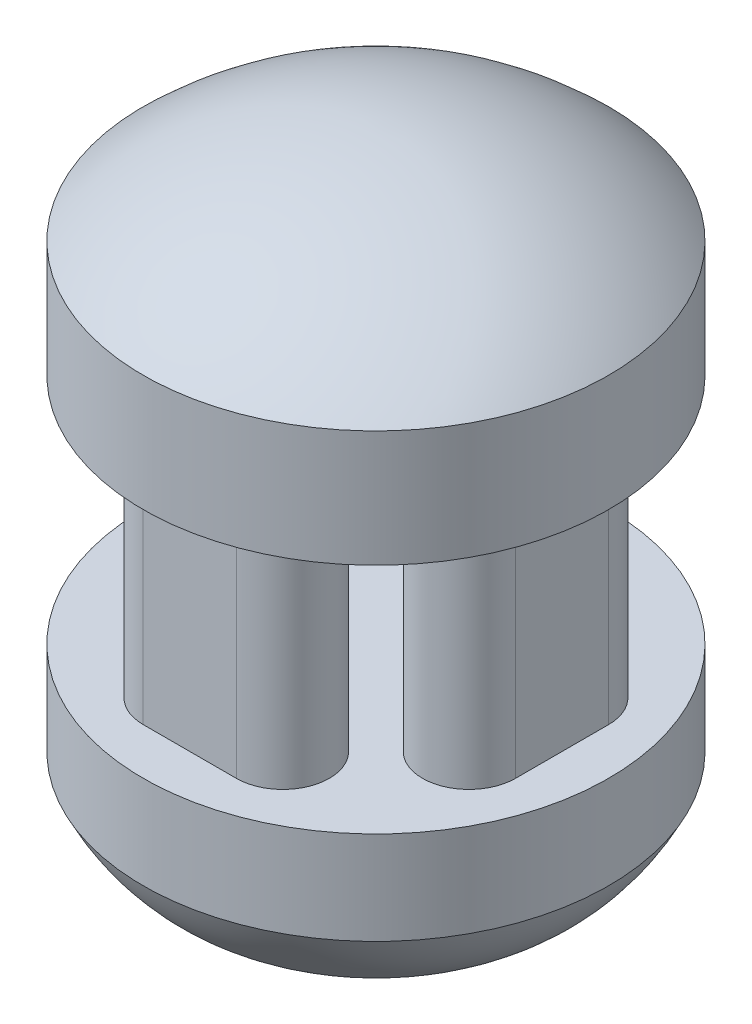
ISO-10303-21;
HEADER;
FILE_DESCRIPTION(('STEP AP214'),'2;1');
FILE_NAME('part.step','',(''),(''),'','','');
FILE_SCHEMA(('AUTOMOTIVE_DESIGN { 1 0 10303 214 1 1 1 1 }'));
ENDSEC;
DATA;
#1=APPLICATION_CONTEXT('core data for automotive mechanical design processes');
#2=APPLICATION_PROTOCOL_DEFINITION('international standard','automotive_design',2000,#1);
#3=PRODUCT_CONTEXT('',#1,'mechanical');
#4=PRODUCT('Part','Part','',(#3));
#5=PRODUCT_RELATED_PRODUCT_CATEGORY('part','',(#4));
#6=PRODUCT_DEFINITION_FORMATION('','',#4);
#7=PRODUCT_DEFINITION_CONTEXT('part definition',#1,'design');
#8=PRODUCT_DEFINITION('design','',#6,#7);
#9=PRODUCT_DEFINITION_SHAPE('','',#8);
#10=(LENGTH_UNIT() NAMED_UNIT(*) SI_UNIT(.MILLI.,.METRE.));
#11=(NAMED_UNIT(*) PLANE_ANGLE_UNIT() SI_UNIT($,.RADIAN.));
#12=(NAMED_UNIT(*) SI_UNIT($,.STERADIAN.) SOLID_ANGLE_UNIT());
#13=UNCERTAINTY_MEASURE_WITH_UNIT(LENGTH_MEASURE(1.E-05),#10,'distance_accuracy_value','');
#14=(GEOMETRIC_REPRESENTATION_CONTEXT(3) GLOBAL_UNCERTAINTY_ASSIGNED_CONTEXT((#13)) GLOBAL_UNIT_ASSIGNED_CONTEXT((#10,
#11,#12)) REPRESENTATION_CONTEXT('',''));
#15=CARTESIAN_POINT('',(0.,0.,0.));
#16=DIRECTION('',(0.,0.,1.));
#17=DIRECTION('',(1.,0.,0.));
#18=AXIS2_PLACEMENT_3D('',#15,#16,#17);
#19=CARTESIAN_POINT('',(-6.35,0.,0.));
#20=DIRECTION('',(0.,1.,0.));
#21=DIRECTION('',(0.,0.,1.));
#22=AXIS2_PLACEMENT_3D('',#19,#20,#21);
#23=PLANE('',#22);
#24=CARTESIAN_POINT('',(1.27,0.,3.81));
#25=DIRECTION('',(0.,-1.,0.));
#26=DIRECTION('',(0.,0.,1.));
#27=AXIS2_PLACEMENT_3D('',#24,#25,#26);
#28=CIRCLE('',#27,1.27);
#29=CARTESIAN_POINT('',(1.27,0.,2.54));
#30=VERTEX_POINT('',#29);
#31=CARTESIAN_POINT('',(1.27,0.,5.08));
#32=VERTEX_POINT('',#31);
#33=EDGE_CURVE('E333',#30,#32,#28,.T.);
#34=ORIENTED_EDGE('',*,*,#33,.F.);
#35=DIRECTION('',(1.,0.,0.));
#36=VECTOR('',#35,1.);
#37=CARTESIAN_POINT('',(1.27,0.,2.54));
#38=LINE('',#37,#36);
#39=CARTESIAN_POINT('',(-1.27,0.,2.54));
#40=VERTEX_POINT('',#39);
#41=EDGE_CURVE('E337',#40,#30,#38,.T.);
#42=ORIENTED_EDGE('',*,*,#41,.F.);
#43=CARTESIAN_POINT('',(-1.27,0.,3.81));
#44=DIRECTION('',(0.,-1.,0.));
#45=DIRECTION('',(0.,0.,1.));
#46=AXIS2_PLACEMENT_3D('',#43,#44,#45);
#47=CIRCLE('',#46,1.27);
#48=CARTESIAN_POINT('',(-1.27,0.,5.08));
#49=VERTEX_POINT('',#48);
#50=EDGE_CURVE('E349',#49,#40,#47,.T.);
#51=ORIENTED_EDGE('',*,*,#50,.F.);
#52=DIRECTION('',(-1.,0.,0.));
#53=VECTOR('',#52,1.);
#54=CARTESIAN_POINT('',(1.27,0.,5.08));
#55=LINE('',#54,#53);
#56=EDGE_CURVE('E346',#32,#49,#55,.T.);
#57=ORIENTED_EDGE('',*,*,#56,.F.);
#58=EDGE_LOOP('',(#34,#42,#51,#57));
#59=FACE_BOUND('',#58,.T.);
#60=CARTESIAN_POINT('',(-1.27,0.,-3.81));
#61=DIRECTION('',(0.,-1.,0.));
#62=DIRECTION('',(0.,0.,-1.));
#63=AXIS2_PLACEMENT_3D('',#60,#61,#62);
#64=CIRCLE('',#63,1.27);
#65=CARTESIAN_POINT('',(-1.27,0.,-2.54));
#66=VERTEX_POINT('',#65);
#67=CARTESIAN_POINT('',(-1.27,0.,-5.08));
#68=VERTEX_POINT('',#67);
#69=EDGE_CURVE('E280',#66,#68,#64,.T.);
#70=ORIENTED_EDGE('',*,*,#69,.F.);
#71=DIRECTION('',(-1.,0.,0.));
#72=VECTOR('',#71,1.);
#73=CARTESIAN_POINT('',(-1.27,0.,-2.54));
#74=LINE('',#73,#72);
#75=CARTESIAN_POINT('',(1.27,0.,-2.54));
#76=VERTEX_POINT('',#75);
#77=EDGE_CURVE('E290',#76,#66,#74,.T.);
#78=ORIENTED_EDGE('',*,*,#77,.F.);
#79=CARTESIAN_POINT('',(1.27,0.,-3.81));
#80=DIRECTION('',(0.,-1.,0.));
#81=DIRECTION('',(0.,0.,-1.));
#82=AXIS2_PLACEMENT_3D('',#79,#80,#81);
#83=CIRCLE('',#82,1.27);
#84=CARTESIAN_POINT('',(1.27,0.,-5.08));
#85=VERTEX_POINT('',#84);
#86=EDGE_CURVE('E287',#85,#76,#83,.T.);
#87=ORIENTED_EDGE('',*,*,#86,.F.);
#88=DIRECTION('',(1.,0.,0.));
#89=VECTOR('',#88,1.);
#90=CARTESIAN_POINT('',(-1.27,0.,-5.08));
#91=LINE('',#90,#89);
#92=EDGE_CURVE('E283',#68,#85,#91,.T.);
#93=ORIENTED_EDGE('',*,*,#92,.F.);
#94=EDGE_LOOP('',(#70,#78,#87,#93));
#95=FACE_BOUND('',#94,.T.);
#96=CARTESIAN_POINT('',(0.,0.,0.));
#97=DIRECTION('',(0.,-1.,0.));
#98=DIRECTION('',(0.,0.,-1.));
#99=AXIS2_PLACEMENT_3D('',#96,#97,#98);
#100=CIRCLE('',#99,6.35);
#101=CARTESIAN_POINT('',(0.,0.,-6.35));
#102=VERTEX_POINT('',#101);
#103=EDGE_CURVE('E41',#102,#102,#100,.T.);
#104=ORIENTED_EDGE('',*,*,#103,.T.);
#105=EDGE_LOOP('',(#104));
#106=FACE_BOUND('',#105,.T.);
#107=CARTESIAN_POINT('',(3.81,0.,-1.26999999999999));
#108=DIRECTION('',(0.,-1.,0.));
#109=DIRECTION('',(1.,0.,0.));
#110=AXIS2_PLACEMENT_3D('',#107,#108,#109);
#111=CIRCLE('',#110,1.27);
#112=CARTESIAN_POINT('',(2.54,0.,-1.26999999999999));
#113=VERTEX_POINT('',#112);
#114=CARTESIAN_POINT('',(5.08,0.,-1.26999999999998));
#115=VERTEX_POINT('',#114);
#116=EDGE_CURVE('E306',#113,#115,#111,.T.);
#117=ORIENTED_EDGE('',*,*,#116,.F.);
#118=DIRECTION('',(0.,0.,-1.));
#119=VECTOR('',#118,1.);
#120=CARTESIAN_POINT('',(2.54,0.,-1.26999999999999));
#121=LINE('',#120,#119);
#122=CARTESIAN_POINT('',(2.53999999999999,0.,1.27000000000001));
#123=VERTEX_POINT('',#122);
#124=EDGE_CURVE('E368',#123,#113,#121,.T.);
#125=ORIENTED_EDGE('',*,*,#124,.F.);
#126=CARTESIAN_POINT('',(3.80999999999999,0.,1.27000000000001));
#127=DIRECTION('',(0.,-1.,0.));
#128=DIRECTION('',(1.,0.,0.));
#129=AXIS2_PLACEMENT_3D('',#126,#127,#128);
#130=CIRCLE('',#129,1.27);
#131=CARTESIAN_POINT('',(5.07999999999999,0.,1.27000000000002));
#132=VERTEX_POINT('',#131);
#133=EDGE_CURVE('E379',#132,#123,#130,.T.);
#134=ORIENTED_EDGE('',*,*,#133,.F.);
#135=DIRECTION('',(0.,0.,1.));
#136=VECTOR('',#135,1.);
#137=CARTESIAN_POINT('',(5.08,0.,-1.26999999999998));
#138=LINE('',#137,#136);
#139=EDGE_CURVE('E376',#115,#132,#138,.T.);
#140=ORIENTED_EDGE('',*,*,#139,.F.);
#141=EDGE_LOOP('',(#117,#125,#134,#140));
#142=FACE_BOUND('',#141,.T.);
#143=CARTESIAN_POINT('',(-3.81000000000001,0.,1.26999999999996));
#144=DIRECTION('',(0.,-1.,0.));
#145=DIRECTION('',(-1.,0.,0.));
#146=AXIS2_PLACEMENT_3D('',#143,#144,#145);
#147=CIRCLE('',#146,1.27);
#148=CARTESIAN_POINT('',(-2.54000000000001,0.,1.26999999999997));
#149=VERTEX_POINT('',#148);
#150=CARTESIAN_POINT('',(-5.08000000000001,0.,1.26999999999995));
#151=VERTEX_POINT('',#150);
#152=EDGE_CURVE('E309',#149,#151,#147,.T.);
#153=ORIENTED_EDGE('',*,*,#152,.F.);
#154=DIRECTION('',(0.,0.,1.));
#155=VECTOR('',#154,1.);
#156=CARTESIAN_POINT('',(-2.54000000000001,0.,1.26999999999997));
#157=LINE('',#156,#155);
#158=CARTESIAN_POINT('',(-2.53999999999999,0.,-1.27000000000003));
#159=VERTEX_POINT('',#158);
#160=EDGE_CURVE('E311',#159,#149,#157,.T.);
#161=ORIENTED_EDGE('',*,*,#160,.F.);
#162=CARTESIAN_POINT('',(-3.80999999999999,0.,-1.27000000000004));
#163=DIRECTION('',(0.,-1.,0.));
#164=DIRECTION('',(-1.,0.,0.));
#165=AXIS2_PLACEMENT_3D('',#162,#163,#164);
#166=CIRCLE('',#165,1.27);
#167=CARTESIAN_POINT('',(-5.07999999999999,0.,-1.27000000000005));
#168=VERTEX_POINT('',#167);
#169=EDGE_CURVE('E53',#168,#159,#166,.T.);
#170=ORIENTED_EDGE('',*,*,#169,.F.);
#171=DIRECTION('',(0.,0.,-1.));
#172=VECTOR('',#171,1.);
#173=CARTESIAN_POINT('',(-5.08000000000001,0.,1.26999999999995));
#174=LINE('',#173,#172);
#175=EDGE_CURVE('E48',#151,#168,#174,.T.);
#176=ORIENTED_EDGE('',*,*,#175,.F.);
#177=EDGE_LOOP('',(#153,#161,#170,#176));
#178=FACE_BOUND('',#177,.T.);
#179=ADVANCED_FACE('F33',(#59,#95,#106,#142,#178),#23,.F.);
#180=CARTESIAN_POINT('',(0.,-3.4925,0.));
#181=DIRECTION('',(0.,0.,1.));
#182=DIRECTION('',(1.,0.,0.));
#183=AXIS2_PLACEMENT_3D('',#180,#181,#182);
#184=SPHERICAL_SURFACE('',#183,9.2075);
#185=CARTESIAN_POINT('',(0.,-3.4925,0.));
#186=DIRECTION('',(0.,-1.,0.));
#187=DIRECTION('',(0.,0.,-1.));
#188=AXIS2_PLACEMENT_3D('',#185,#186,#187);
#189=SPHERICAL_SURFACE('',#188,9.2075);
#190=CARTESIAN_POINT('',(0.,3.175,0.));
#191=DIRECTION('',(0.,-1.,0.));
#192=DIRECTION('',(0.,0.,-1.));
#193=AXIS2_PLACEMENT_3D('',#190,#191,#192);
#194=CIRCLE('',#193,6.35);
#195=CARTESIAN_POINT('',(0.,3.175,-6.35));
#196=VERTEX_POINT('',#195);
#197=EDGE_CURVE('E11',#196,#196,#194,.T.);
#198=ORIENTED_EDGE('',*,*,#197,.F.);
#199=EDGE_LOOP('',(#198));
#200=FACE_BOUND('',#199,.T.);
#201=ADVANCED_FACE('F35',(#200),#189,.T.);
#202=CARTESIAN_POINT('',(0.,0.,0.));
#203=DIRECTION('',(0.,-1.,0.));
#204=DIRECTION('',(0.,0.,-1.));
#205=AXIS2_PLACEMENT_3D('',#202,#203,#204);
#206=CYLINDRICAL_SURFACE('',#205,6.35);
#207=ORIENTED_EDGE('',*,*,#103,.F.);
#208=EDGE_LOOP('',(#207));
#209=FACE_BOUND('',#208,.T.);
#210=ORIENTED_EDGE('',*,*,#197,.T.);
#211=EDGE_LOOP('',(#210));
#212=FACE_BOUND('',#211,.T.);
#213=ADVANCED_FACE('F164',(#209,#212),#206,.T.);
#214=CARTESIAN_POINT('',(-1.27,-6.35,-3.81));
#215=DIRECTION('',(0.,1.,0.));
#216=DIRECTION('',(0.,0.,1.));
#217=AXIS2_PLACEMENT_3D('',#214,#215,#216);
#218=CYLINDRICAL_SURFACE('',#217,1.27);
#219=ORIENTED_EDGE('',*,*,#69,.T.);
#220=DIRECTION('',(0.,1.,0.));
#221=VECTOR('',#220,1.);
#222=CARTESIAN_POINT('',(-1.27,-6.35,-5.08));
#223=LINE('',#222,#221);
#224=CARTESIAN_POINT('',(-1.27,-6.35,-5.08));
#225=VERTEX_POINT('',#224);
#226=EDGE_CURVE('E297',#225,#68,#223,.T.);
#227=ORIENTED_EDGE('',*,*,#226,.F.);
#228=CARTESIAN_POINT('',(-1.27,-6.35,-3.81));
#229=DIRECTION('',(0.,-1.,0.));
#230=DIRECTION('',(0.,0.,-1.));
#231=AXIS2_PLACEMENT_3D('',#228,#229,#230);
#232=CIRCLE('',#231,1.27);
#233=CARTESIAN_POINT('',(-1.27,-6.35,-2.54));
#234=VERTEX_POINT('',#233);
#235=EDGE_CURVE('E266',#234,#225,#232,.T.);
#236=ORIENTED_EDGE('',*,*,#235,.F.);
#237=DIRECTION('',(0.,1.,0.));
#238=VECTOR('',#237,1.);
#239=CARTESIAN_POINT('',(-1.27,-6.35,-2.54));
#240=LINE('',#239,#238);
#241=EDGE_CURVE('E271',#234,#66,#240,.T.);
#242=ORIENTED_EDGE('',*,*,#241,.T.);
#243=EDGE_LOOP('',(#219,#227,#236,#242));
#244=FACE_BOUND('',#243,.T.);
#245=ADVANCED_FACE('F170',(#244),#218,.T.);
#246=CARTESIAN_POINT('',(-1.27,-6.35,-5.08));
#247=DIRECTION('',(0.,0.,1.));
#248=DIRECTION('',(1.,0.,0.));
#249=AXIS2_PLACEMENT_3D('',#246,#247,#248);
#250=PLANE('',#249);
#251=ORIENTED_EDGE('',*,*,#92,.T.);
#252=DIRECTION('',(0.,1.,0.));
#253=VECTOR('',#252,1.);
#254=CARTESIAN_POINT('',(1.27,-6.35,-5.08));
#255=LINE('',#254,#253);
#256=CARTESIAN_POINT('',(1.27,-6.35,-5.08));
#257=VERTEX_POINT('',#256);
#258=EDGE_CURVE('E294',#257,#85,#255,.T.);
#259=ORIENTED_EDGE('',*,*,#258,.F.);
#260=DIRECTION('',(1.,0.,0.));
#261=VECTOR('',#260,1.);
#262=CARTESIAN_POINT('',(-1.27,-6.35,-5.08));
#263=LINE('',#262,#261);
#264=EDGE_CURVE('E276',#225,#257,#263,.T.);
#265=ORIENTED_EDGE('',*,*,#264,.F.);
#266=ORIENTED_EDGE('',*,*,#226,.T.);
#267=EDGE_LOOP('',(#251,#259,#265,#266));
#268=FACE_BOUND('',#267,.T.);
#269=ADVANCED_FACE('F174',(#268),#250,.F.);
#270=CARTESIAN_POINT('',(1.27,-6.35,-3.81));
#271=DIRECTION('',(0.,1.,0.));
#272=DIRECTION('',(0.,0.,1.));
#273=AXIS2_PLACEMENT_3D('',#270,#271,#272);
#274=CYLINDRICAL_SURFACE('',#273,1.27);
#275=ORIENTED_EDGE('',*,*,#86,.T.);
#276=DIRECTION('',(0.,1.,0.));
#277=VECTOR('',#276,1.);
#278=CARTESIAN_POINT('',(1.27,-6.35,-2.54));
#279=LINE('',#278,#277);
#280=CARTESIAN_POINT('',(1.27,-6.35,-2.54));
#281=VERTEX_POINT('',#280);
#282=EDGE_CURVE('E274',#281,#76,#279,.T.);
#283=ORIENTED_EDGE('',*,*,#282,.F.);
#284=CARTESIAN_POINT('',(1.27,-6.35,-3.81));
#285=DIRECTION('',(0.,-1.,0.));
#286=DIRECTION('',(0.,0.,-1.));
#287=AXIS2_PLACEMENT_3D('',#284,#285,#286);
#288=CIRCLE('',#287,1.27);
#289=EDGE_CURVE('E268',#257,#281,#288,.T.);
#290=ORIENTED_EDGE('',*,*,#289,.F.);
#291=ORIENTED_EDGE('',*,*,#258,.T.);
#292=EDGE_LOOP('',(#275,#283,#290,#291));
#293=FACE_BOUND('',#292,.T.);
#294=ADVANCED_FACE('F178',(#293),#274,.T.);
#295=CARTESIAN_POINT('',(-1.27,-6.35,-2.54));
#296=DIRECTION('',(0.,0.,-1.));
#297=DIRECTION('',(-1.,0.,0.));
#298=AXIS2_PLACEMENT_3D('',#295,#296,#297);
#299=PLANE('',#298);
#300=ORIENTED_EDGE('',*,*,#77,.T.);
#301=ORIENTED_EDGE('',*,*,#241,.F.);
#302=DIRECTION('',(-1.,0.,0.));
#303=VECTOR('',#302,1.);
#304=CARTESIAN_POINT('',(-1.27,-6.35,-2.54));
#305=LINE('',#304,#303);
#306=EDGE_CURVE('E264',#281,#234,#305,.T.);
#307=ORIENTED_EDGE('',*,*,#306,.F.);
#308=ORIENTED_EDGE('',*,*,#282,.T.);
#309=EDGE_LOOP('',(#300,#301,#307,#308));
#310=FACE_BOUND('',#309,.T.);
#311=ADVANCED_FACE('F182',(#310),#299,.F.);
#312=CARTESIAN_POINT('',(3.81,-6.35,-1.26999999999999));
#313=DIRECTION('',(0.,1.,0.));
#314=DIRECTION('',(0.,0.,1.));
#315=AXIS2_PLACEMENT_3D('',#312,#313,#314);
#316=CYLINDRICAL_SURFACE('',#315,1.27);
#317=ORIENTED_EDGE('',*,*,#116,.T.);
#318=DIRECTION('',(0.,1.,0.));
#319=VECTOR('',#318,1.);
#320=CARTESIAN_POINT('',(5.08,-6.35,-1.26999999999998));
#321=LINE('',#320,#319);
#322=CARTESIAN_POINT('',(5.08,-6.35,-1.26999999999998));
#323=VERTEX_POINT('',#322);
#324=EDGE_CURVE('E284',#323,#115,#321,.T.);
#325=ORIENTED_EDGE('',*,*,#324,.F.);
#326=CARTESIAN_POINT('',(3.81,-6.35,-1.26999999999999));
#327=DIRECTION('',(0.,-1.,0.));
#328=DIRECTION('',(1.,0.,0.));
#329=AXIS2_PLACEMENT_3D('',#326,#327,#328);
#330=CIRCLE('',#329,1.27);
#331=CARTESIAN_POINT('',(2.54,-6.35,-1.26999999999999));
#332=VERTEX_POINT('',#331);
#333=EDGE_CURVE('E365',#332,#323,#330,.T.);
#334=ORIENTED_EDGE('',*,*,#333,.F.);
#335=DIRECTION('',(0.,1.,0.));
#336=VECTOR('',#335,1.);
#337=CARTESIAN_POINT('',(2.54,-6.35,-1.26999999999999));
#338=LINE('',#337,#336);
#339=EDGE_CURVE('E374',#332,#113,#338,.T.);
#340=ORIENTED_EDGE('',*,*,#339,.T.);
#341=EDGE_LOOP('',(#317,#325,#334,#340));
#342=FACE_BOUND('',#341,.T.);
#343=ADVANCED_FACE('F186',(#342),#316,.T.);
#344=CARTESIAN_POINT('',(5.08,-6.35,-1.26999999999998));
#345=DIRECTION('',(-1.,0.,0.));
#346=DIRECTION('',(0.,0.,1.));
#347=AXIS2_PLACEMENT_3D('',#344,#345,#346);
#348=PLANE('',#347);
#349=ORIENTED_EDGE('',*,*,#139,.T.);
#350=DIRECTION('',(0.,1.,0.));
#351=VECTOR('',#350,1.);
#352=CARTESIAN_POINT('',(5.07999999999999,-6.35,1.27000000000002));
#353=LINE('',#352,#351);
#354=CARTESIAN_POINT('',(5.07999999999999,-6.35,1.27000000000002));
#355=VERTEX_POINT('',#354);
#356=EDGE_CURVE('E388',#355,#132,#353,.T.);
#357=ORIENTED_EDGE('',*,*,#356,.F.);
#358=DIRECTION('',(0.,0.,1.));
#359=VECTOR('',#358,1.);
#360=CARTESIAN_POINT('',(5.08,-6.35,-1.26999999999998));
#361=LINE('',#360,#359);
#362=EDGE_CURVE('E367',#323,#355,#361,.T.);
#363=ORIENTED_EDGE('',*,*,#362,.F.);
#364=ORIENTED_EDGE('',*,*,#324,.T.);
#365=EDGE_LOOP('',(#349,#357,#363,#364));
#366=FACE_BOUND('',#365,.T.);
#367=ADVANCED_FACE('F190',(#366),#348,.F.);
#368=CARTESIAN_POINT('',(3.80999999999999,-6.35,1.27000000000001));
#369=DIRECTION('',(0.,1.,0.));
#370=DIRECTION('',(0.,0.,1.));
#371=AXIS2_PLACEMENT_3D('',#368,#369,#370);
#372=CYLINDRICAL_SURFACE('',#371,1.27);
#373=ORIENTED_EDGE('',*,*,#133,.T.);
#374=DIRECTION('',(0.,1.,0.));
#375=VECTOR('',#374,1.);
#376=CARTESIAN_POINT('',(2.53999999999999,-6.35,1.27000000000001));
#377=LINE('',#376,#375);
#378=CARTESIAN_POINT('',(2.53999999999999,-6.35,1.27000000000001));
#379=VERTEX_POINT('',#378);
#380=EDGE_CURVE('E385',#379,#123,#377,.T.);
#381=ORIENTED_EDGE('',*,*,#380,.F.);
#382=CARTESIAN_POINT('',(3.80999999999999,-6.35,1.27000000000001));
#383=DIRECTION('',(0.,-1.,0.));
#384=DIRECTION('',(1.,0.,0.));
#385=AXIS2_PLACEMENT_3D('',#382,#383,#384);
#386=CIRCLE('',#385,1.27);
#387=EDGE_CURVE('E371',#355,#379,#386,.T.);
#388=ORIENTED_EDGE('',*,*,#387,.F.);
#389=ORIENTED_EDGE('',*,*,#356,.T.);
#390=EDGE_LOOP('',(#373,#381,#388,#389));
#391=FACE_BOUND('',#390,.T.);
#392=ADVANCED_FACE('F194',(#391),#372,.T.);
#393=CARTESIAN_POINT('',(2.54,-6.35,-1.26999999999999));
#394=DIRECTION('',(1.,0.,0.));
#395=DIRECTION('',(0.,0.,-1.));
#396=AXIS2_PLACEMENT_3D('',#393,#394,#395);
#397=PLANE('',#396);
#398=ORIENTED_EDGE('',*,*,#124,.T.);
#399=ORIENTED_EDGE('',*,*,#339,.F.);
#400=DIRECTION('',(0.,0.,-1.));
#401=VECTOR('',#400,1.);
#402=CARTESIAN_POINT('',(2.54,-6.35,-1.26999999999999));
#403=LINE('',#402,#401);
#404=EDGE_CURVE('E243',#379,#332,#403,.T.);
#405=ORIENTED_EDGE('',*,*,#404,.F.);
#406=ORIENTED_EDGE('',*,*,#380,.T.);
#407=EDGE_LOOP('',(#398,#399,#405,#406));
#408=FACE_BOUND('',#407,.T.);
#409=ADVANCED_FACE('F198',(#408),#397,.F.);
#410=CARTESIAN_POINT('',(1.27,-6.35,3.81));
#411=DIRECTION('',(0.,1.,0.));
#412=DIRECTION('',(0.,0.,1.));
#413=AXIS2_PLACEMENT_3D('',#410,#411,#412);
#414=CYLINDRICAL_SURFACE('',#413,1.27);
#415=ORIENTED_EDGE('',*,*,#33,.T.);
#416=DIRECTION('',(0.,1.,0.));
#417=VECTOR('',#416,1.);
#418=CARTESIAN_POINT('',(1.27,-6.35,5.08));
#419=LINE('',#418,#417);
#420=CARTESIAN_POINT('',(1.27,-6.35,5.08));
#421=VERTEX_POINT('',#420);
#422=EDGE_CURVE('E362',#421,#32,#419,.T.);
#423=ORIENTED_EDGE('',*,*,#422,.F.);
#424=CARTESIAN_POINT('',(1.27,-6.35,3.81));
#425=DIRECTION('',(0.,-1.,0.));
#426=DIRECTION('',(0.,0.,1.));
#427=AXIS2_PLACEMENT_3D('',#424,#425,#426);
#428=CIRCLE('',#427,1.27);
#429=CARTESIAN_POINT('',(1.27,-6.35,2.54));
#430=VERTEX_POINT('',#429);
#431=EDGE_CURVE('E334',#430,#421,#428,.T.);
#432=ORIENTED_EDGE('',*,*,#431,.F.);
#433=DIRECTION('',(0.,1.,0.));
#434=VECTOR('',#433,1.);
#435=CARTESIAN_POINT('',(1.27,-6.35,2.54));
#436=LINE('',#435,#434);
#437=EDGE_CURVE('E343',#430,#30,#436,.T.);
#438=ORIENTED_EDGE('',*,*,#437,.T.);
#439=EDGE_LOOP('',(#415,#423,#432,#438));
#440=FACE_BOUND('',#439,.T.);
#441=ADVANCED_FACE('F202',(#440),#414,.T.);
#442=CARTESIAN_POINT('',(1.27,-6.35,5.08));
#443=DIRECTION('',(0.,0.,-1.));
#444=DIRECTION('',(-1.,0.,0.));
#445=AXIS2_PLACEMENT_3D('',#442,#443,#444);
#446=PLANE('',#445);
#447=ORIENTED_EDGE('',*,*,#56,.T.);
#448=DIRECTION('',(0.,1.,0.));
#449=VECTOR('',#448,1.);
#450=CARTESIAN_POINT('',(-1.27,-6.35,5.08));
#451=LINE('',#450,#449);
#452=CARTESIAN_POINT('',(-1.27,-6.35,5.08));
#453=VERTEX_POINT('',#452);
#454=EDGE_CURVE('E359',#453,#49,#451,.T.);
#455=ORIENTED_EDGE('',*,*,#454,.F.);
#456=DIRECTION('',(-1.,0.,0.));
#457=VECTOR('',#456,1.);
#458=CARTESIAN_POINT('',(1.27,-6.35,5.08));
#459=LINE('',#458,#457);
#460=EDGE_CURVE('E336',#421,#453,#459,.T.);
#461=ORIENTED_EDGE('',*,*,#460,.F.);
#462=ORIENTED_EDGE('',*,*,#422,.T.);
#463=EDGE_LOOP('',(#447,#455,#461,#462));
#464=FACE_BOUND('',#463,.T.);
#465=ADVANCED_FACE('F206',(#464),#446,.F.);
#466=CARTESIAN_POINT('',(-1.27,-6.35,3.81));
#467=DIRECTION('',(0.,1.,0.));
#468=DIRECTION('',(0.,0.,1.));
#469=AXIS2_PLACEMENT_3D('',#466,#467,#468);
#470=CYLINDRICAL_SURFACE('',#469,1.27);
#471=ORIENTED_EDGE('',*,*,#50,.T.);
#472=DIRECTION('',(0.,1.,0.));
#473=VECTOR('',#472,1.);
#474=CARTESIAN_POINT('',(-1.27,-6.35,2.54));
#475=LINE('',#474,#473);
#476=CARTESIAN_POINT('',(-1.27,-6.35,2.54));
#477=VERTEX_POINT('',#476);
#478=EDGE_CURVE('E356',#477,#40,#475,.T.);
#479=ORIENTED_EDGE('',*,*,#478,.F.);
#480=CARTESIAN_POINT('',(-1.27,-6.35,3.81));
#481=DIRECTION('',(0.,-1.,0.));
#482=DIRECTION('',(0.,0.,1.));
#483=AXIS2_PLACEMENT_3D('',#480,#481,#482);
#484=CIRCLE('',#483,1.27);
#485=EDGE_CURVE('E340',#453,#477,#484,.T.);
#486=ORIENTED_EDGE('',*,*,#485,.F.);
#487=ORIENTED_EDGE('',*,*,#454,.T.);
#488=EDGE_LOOP('',(#471,#479,#486,#487));
#489=FACE_BOUND('',#488,.T.);
#490=ADVANCED_FACE('F210',(#489),#470,.T.);
#491=CARTESIAN_POINT('',(1.27,-6.35,2.54));
#492=DIRECTION('',(0.,0.,1.));
#493=DIRECTION('',(1.,0.,0.));
#494=AXIS2_PLACEMENT_3D('',#491,#492,#493);
#495=PLANE('',#494);
#496=ORIENTED_EDGE('',*,*,#41,.T.);
#497=ORIENTED_EDGE('',*,*,#437,.F.);
#498=DIRECTION('',(1.,0.,0.));
#499=VECTOR('',#498,1.);
#500=CARTESIAN_POINT('',(1.27,-6.35,2.54));
#501=LINE('',#500,#499);
#502=EDGE_CURVE('E259',#477,#430,#501,.T.);
#503=ORIENTED_EDGE('',*,*,#502,.F.);
#504=ORIENTED_EDGE('',*,*,#478,.T.);
#505=EDGE_LOOP('',(#496,#497,#503,#504));
#506=FACE_BOUND('',#505,.T.);
#507=ADVANCED_FACE('F214',(#506),#495,.F.);
#508=CARTESIAN_POINT('',(-3.81000000000001,-6.35,1.26999999999996));
#509=DIRECTION('',(0.,1.,0.));
#510=DIRECTION('',(0.,0.,1.));
#511=AXIS2_PLACEMENT_3D('',#508,#509,#510);
#512=CYLINDRICAL_SURFACE('',#511,1.27);
#513=ORIENTED_EDGE('',*,*,#152,.T.);
#514=DIRECTION('',(0.,1.,0.));
#515=VECTOR('',#514,1.);
#516=CARTESIAN_POINT('',(-5.08000000000001,-6.35,1.26999999999995));
#517=LINE('',#516,#515);
#518=CARTESIAN_POINT('',(-5.08000000000001,-6.35,1.26999999999995));
#519=VERTEX_POINT('',#518);
#520=EDGE_CURVE('E331',#519,#151,#517,.T.);
#521=ORIENTED_EDGE('',*,*,#520,.F.);
#522=CARTESIAN_POINT('',(-3.81000000000001,-6.35,1.26999999999996));
#523=DIRECTION('',(0.,-1.,0.));
#524=DIRECTION('',(-1.,0.,0.));
#525=AXIS2_PLACEMENT_3D('',#522,#523,#524);
#526=CIRCLE('',#525,1.27);
#527=CARTESIAN_POINT('',(-2.54000000000001,-6.35,1.26999999999997));
#528=VERTEX_POINT('',#527);
#529=EDGE_CURVE('E320',#528,#519,#526,.T.);
#530=ORIENTED_EDGE('',*,*,#529,.F.);
#531=DIRECTION('',(0.,1.,0.));
#532=VECTOR('',#531,1.);
#533=CARTESIAN_POINT('',(-2.54000000000001,-6.35,1.26999999999997));
#534=LINE('',#533,#532);
#535=EDGE_CURVE('E318',#528,#149,#534,.T.);
#536=ORIENTED_EDGE('',*,*,#535,.T.);
#537=EDGE_LOOP('',(#513,#521,#530,#536));
#538=FACE_BOUND('',#537,.T.);
#539=ADVANCED_FACE('F218',(#538),#512,.T.);
#540=CARTESIAN_POINT('',(-5.08000000000001,-6.35,1.26999999999995));
#541=DIRECTION('',(1.,0.,0.));
#542=DIRECTION('',(0.,0.,-1.));
#543=AXIS2_PLACEMENT_3D('',#540,#541,#542);
#544=PLANE('',#543);
#545=ORIENTED_EDGE('',*,*,#175,.T.);
#546=DIRECTION('',(0.,1.,0.));
#547=VECTOR('',#546,1.);
#548=CARTESIAN_POINT('',(-5.07999999999999,-6.35,-1.27000000000005));
#549=LINE('',#548,#547);
#550=CARTESIAN_POINT('',(-5.07999999999999,-6.35,-1.27000000000005));
#551=VERTEX_POINT('',#550);
#552=EDGE_CURVE('E323',#551,#168,#549,.T.);
#553=ORIENTED_EDGE('',*,*,#552,.F.);
#554=DIRECTION('',(0.,0.,-1.));
#555=VECTOR('',#554,1.);
#556=CARTESIAN_POINT('',(-5.08000000000001,-6.35,1.26999999999995));
#557=LINE('',#556,#555);
#558=EDGE_CURVE('E401',#519,#551,#557,.T.);
#559=ORIENTED_EDGE('',*,*,#558,.F.);
#560=ORIENTED_EDGE('',*,*,#520,.T.);
#561=EDGE_LOOP('',(#545,#553,#559,#560));
#562=FACE_BOUND('',#561,.T.);
#563=ADVANCED_FACE('F222',(#562),#544,.F.);
#564=CARTESIAN_POINT('',(-3.80999999999999,-6.35,-1.27000000000004));
#565=DIRECTION('',(0.,1.,0.));
#566=DIRECTION('',(0.,0.,1.));
#567=AXIS2_PLACEMENT_3D('',#564,#565,#566);
#568=CYLINDRICAL_SURFACE('',#567,1.27);
#569=ORIENTED_EDGE('',*,*,#169,.T.);
#570=DIRECTION('',(0.,1.,0.));
#571=VECTOR('',#570,1.);
#572=CARTESIAN_POINT('',(-2.53999999999999,-6.35,-1.27000000000003));
#573=LINE('',#572,#571);
#574=CARTESIAN_POINT('',(-2.53999999999999,-6.35,-1.27000000000003));
#575=VERTEX_POINT('',#574);
#576=EDGE_CURVE('E319',#575,#159,#573,.T.);
#577=ORIENTED_EDGE('',*,*,#576,.F.);
#578=CARTESIAN_POINT('',(-3.80999999999999,-6.35,-1.27000000000004));
#579=DIRECTION('',(0.,-1.,0.));
#580=DIRECTION('',(-1.,0.,0.));
#581=AXIS2_PLACEMENT_3D('',#578,#579,#580);
#582=CIRCLE('',#581,1.27);
#583=EDGE_CURVE('E325',#551,#575,#582,.T.);
#584=ORIENTED_EDGE('',*,*,#583,.F.);
#585=ORIENTED_EDGE('',*,*,#552,.T.);
#586=EDGE_LOOP('',(#569,#577,#584,#585));
#587=FACE_BOUND('',#586,.T.);
#588=ADVANCED_FACE('F226',(#587),#568,.T.);
#589=CARTESIAN_POINT('',(-2.54000000000001,-6.35,1.26999999999997));
#590=DIRECTION('',(-1.,0.,0.));
#591=DIRECTION('',(0.,0.,1.));
#592=AXIS2_PLACEMENT_3D('',#589,#590,#591);
#593=PLANE('',#592);
#594=ORIENTED_EDGE('',*,*,#160,.T.);
#595=ORIENTED_EDGE('',*,*,#535,.F.);
#596=DIRECTION('',(0.,0.,1.));
#597=VECTOR('',#596,1.);
#598=CARTESIAN_POINT('',(-2.54000000000001,-6.35,1.26999999999997));
#599=LINE('',#598,#597);
#600=EDGE_CURVE('E249',#575,#528,#599,.T.);
#601=ORIENTED_EDGE('',*,*,#600,.F.);
#602=ORIENTED_EDGE('',*,*,#576,.T.);
#603=EDGE_LOOP('',(#594,#595,#601,#602));
#604=FACE_BOUND('',#603,.T.);
#605=ADVANCED_FACE('F230',(#604),#593,.F.);
#606=CARTESIAN_POINT('',(0.,-6.35,0.));
#607=DIRECTION('',(0.,-1.,0.));
#608=DIRECTION('',(0.,0.,-1.));
#609=AXIS2_PLACEMENT_3D('',#606,#607,#608);
#610=PLANE('',#609);
#611=ORIENTED_EDGE('',*,*,#404,.T.);
#612=ORIENTED_EDGE('',*,*,#333,.T.);
#613=ORIENTED_EDGE('',*,*,#362,.T.);
#614=ORIENTED_EDGE('',*,*,#387,.T.);
#615=EDGE_LOOP('',(#611,#612,#613,#614));
#616=FACE_BOUND('',#615,.T.);
#617=ORIENTED_EDGE('',*,*,#600,.T.);
#618=ORIENTED_EDGE('',*,*,#529,.T.);
#619=ORIENTED_EDGE('',*,*,#558,.T.);
#620=ORIENTED_EDGE('',*,*,#583,.T.);
#621=EDGE_LOOP('',(#617,#618,#619,#620));
#622=FACE_BOUND('',#621,.T.);
#623=CARTESIAN_POINT('',(0.,-6.35,0.));
#624=DIRECTION('',(0.,-1.,0.));
#625=DIRECTION('',(0.,0.,-1.));
#626=AXIS2_PLACEMENT_3D('',#623,#624,#625);
#627=CIRCLE('',#626,6.35);
#628=CARTESIAN_POINT('',(0.,-6.35,-6.35));
#629=VERTEX_POINT('',#628);
#630=EDGE_CURVE('E253',#629,#629,#627,.T.);
#631=ORIENTED_EDGE('',*,*,#630,.F.);
#632=EDGE_LOOP('',(#631));
#633=FACE_BOUND('',#632,.T.);
#634=ORIENTED_EDGE('',*,*,#502,.T.);
#635=ORIENTED_EDGE('',*,*,#431,.T.);
#636=ORIENTED_EDGE('',*,*,#460,.T.);
#637=ORIENTED_EDGE('',*,*,#485,.T.);
#638=EDGE_LOOP('',(#634,#635,#636,#637));
#639=FACE_BOUND('',#638,.T.);
#640=ORIENTED_EDGE('',*,*,#306,.T.);
#641=ORIENTED_EDGE('',*,*,#235,.T.);
#642=ORIENTED_EDGE('',*,*,#264,.T.);
#643=ORIENTED_EDGE('',*,*,#289,.T.);
#644=EDGE_LOOP('',(#640,#641,#642,#643));
#645=FACE_BOUND('',#644,.T.);
#646=ADVANCED_FACE('F153',(#616,#622,#633,#639,#645),#610,.F.);
#647=CARTESIAN_POINT('',(0.,-8.89,0.));
#648=DIRECTION('',(0.,1.,0.));
#649=DIRECTION('',(0.,0.,1.));
#650=AXIS2_PLACEMENT_3D('',#647,#648,#649);
#651=CYLINDRICAL_SURFACE('',#650,6.35);
#652=CARTESIAN_POINT('',(0.,-8.89,0.));
#653=DIRECTION('',(0.,-1.,0.));
#654=DIRECTION('',(0.,0.,-1.));
#655=AXIS2_PLACEMENT_3D('',#652,#653,#654);
#656=CIRCLE('',#655,6.35);
#657=CARTESIAN_POINT('',(0.,-8.89,-6.35));
#658=VERTEX_POINT('',#657);
#659=EDGE_CURVE('E314',#658,#658,#656,.T.);
#660=ORIENTED_EDGE('',*,*,#659,.F.);
#661=EDGE_LOOP('',(#660));
#662=FACE_BOUND('',#661,.T.);
#663=ORIENTED_EDGE('',*,*,#630,.T.);
#664=EDGE_LOOP('',(#663));
#665=FACE_BOUND('',#664,.T.);
#666=ADVANCED_FACE('F147',(#662,#665),#651,.T.);
#667=CARTESIAN_POINT('',(0.,-11.938,0.));
#668=CARTESIAN_POINT('',(0.,-11.938,-2.96328974108746));
#669=CARTESIAN_POINT('',(0.,-11.5541589351146,-5.03819366873129));
#670=CARTESIAN_POINT('',(0.,-8.89,-6.35));
#671=B_SPLINE_CURVE_WITH_KNOTS('',3,(#667,#668,#669,#670),.UNSPECIFIED.,.F.,.F.,(4,4),(0.,1.),.UNSPECIFIED.);
#672=CARTESIAN_POINT('',(0.,-8.89,0.));
#673=DIRECTION('',(0.,1.,0.));
#674=AXIS1_PLACEMENT('',#672,#673);
#675=SURFACE_OF_REVOLUTION('',#671,#674);
#676=ORIENTED_EDGE('',*,*,#659,.T.);
#677=EDGE_LOOP('',(#676));
#678=FACE_BOUND('',#677,.T.);
#679=CARTESIAN_POINT('',(0.,-11.938,0.));
#680=VERTEX_POINT('',#679);
#681=VERTEX_LOOP('',#680);
#682=FACE_BOUND('',#681,.T.);
#683=ADVANCED_FACE('F145',(#678,#682),#675,.T.);
#684=CLOSED_SHELL('',(#179,#201,#213,#245,#269,#294,#311,#343,#367,#392,#409,#441,#465,#490,
#507,#539,#563,#588,#605,#646,#666,#683));
#685=MANIFOLD_SOLID_BREP('B2',#684);
#686=ADVANCED_BREP_SHAPE_REPRESENTATION('',(#18,#685),#14);
#687=SHAPE_DEFINITION_REPRESENTATION(#9,#686);
ENDSEC;
END-ISO-10303-21;
